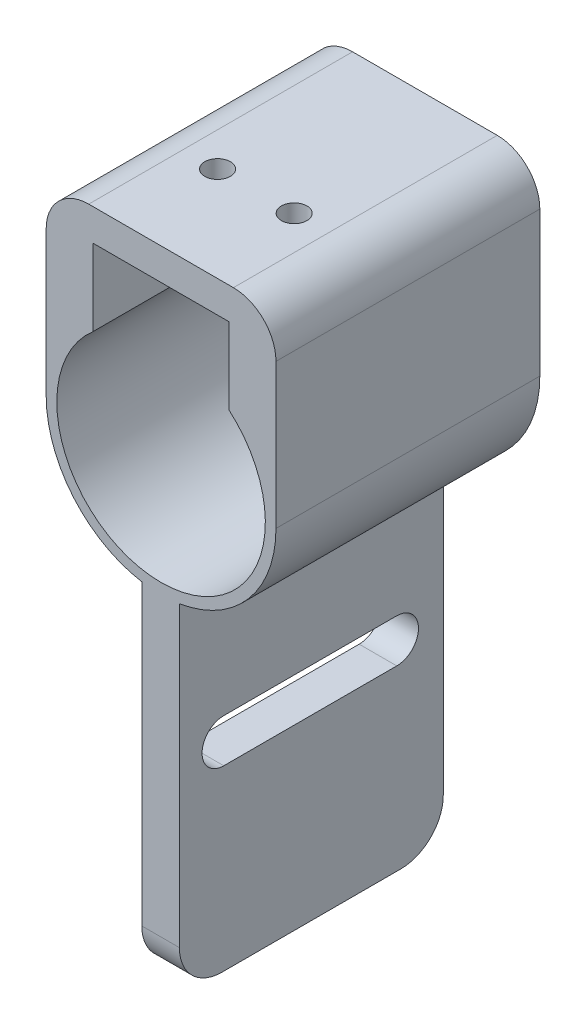
ISO-10303-21;
HEADER;
FILE_DESCRIPTION(('STEP AP214'),'2;1');
FILE_NAME('part.step','',(''),(''),'','','');
FILE_SCHEMA(('AUTOMOTIVE_DESIGN { 1 0 10303 214 1 1 1 1 }'));
ENDSEC;
DATA;
#1=APPLICATION_CONTEXT('core data for automotive mechanical design processes');
#2=APPLICATION_PROTOCOL_DEFINITION('international standard','automotive_design',2000,#1);
#3=PRODUCT_CONTEXT('',#1,'mechanical');
#4=PRODUCT('Part','Part','',(#3));
#5=PRODUCT_RELATED_PRODUCT_CATEGORY('part','',(#4));
#6=PRODUCT_DEFINITION_FORMATION('','',#4);
#7=PRODUCT_DEFINITION_CONTEXT('part definition',#1,'design');
#8=PRODUCT_DEFINITION('design','',#6,#7);
#9=PRODUCT_DEFINITION_SHAPE('','',#8);
#10=(LENGTH_UNIT() NAMED_UNIT(*) SI_UNIT(.MILLI.,.METRE.));
#11=(NAMED_UNIT(*) PLANE_ANGLE_UNIT() SI_UNIT($,.RADIAN.));
#12=(NAMED_UNIT(*) SI_UNIT($,.STERADIAN.) SOLID_ANGLE_UNIT());
#13=UNCERTAINTY_MEASURE_WITH_UNIT(LENGTH_MEASURE(1.E-05),#10,'distance_accuracy_value','');
#14=(GEOMETRIC_REPRESENTATION_CONTEXT(3) GLOBAL_UNCERTAINTY_ASSIGNED_CONTEXT((#13)) GLOBAL_UNIT_ASSIGNED_CONTEXT((#10,
#11,#12)) REPRESENTATION_CONTEXT('',''));
#15=CARTESIAN_POINT('',(0.,0.,0.));
#16=DIRECTION('',(0.,0.,1.));
#17=DIRECTION('',(1.,0.,0.));
#18=AXIS2_PLACEMENT_3D('',#15,#16,#17);
#19=CARTESIAN_POINT('',(0.,0.,31.));
#20=DIRECTION('',(0.,0.,1.));
#21=DIRECTION('',(1.,0.,0.));
#22=AXIS2_PLACEMENT_3D('',#19,#20,#21);
#23=PLANE('',#22);
#24=DIRECTION('',(0.,-1.,0.));
#25=VECTOR('',#24,1.);
#26=CARTESIAN_POINT('',(-8.,9.27698765763974,31.));
#27=LINE('',#26,#25);
#28=CARTESIAN_POINT('',(-8.,18.2769876576397,31.));
#29=VERTEX_POINT('',#28);
#30=CARTESIAN_POINT('',(-8.,9.27698765763974,31.));
#31=VERTEX_POINT('',#30);
#32=EDGE_CURVE('E235',#29,#31,#27,.T.);
#33=ORIENTED_EDGE('',*,*,#32,.F.);
#34=DIRECTION('',(-1.,0.,0.));
#35=VECTOR('',#34,1.);
#36=CARTESIAN_POINT('',(-8.,18.2769876576397,31.));
#37=LINE('',#36,#35);
#38=CARTESIAN_POINT('',(8.,18.2769876576397,31.));
#39=VERTEX_POINT('',#38);
#40=EDGE_CURVE('E236',#39,#29,#37,.T.);
#41=ORIENTED_EDGE('',*,*,#40,.F.);
#42=DIRECTION('',(0.,1.,0.));
#43=VECTOR('',#42,1.);
#44=CARTESIAN_POINT('',(8.,9.27698765763974,31.));
#45=LINE('',#44,#43);
#46=CARTESIAN_POINT('',(8.,9.27698765763974,31.));
#47=VERTEX_POINT('',#46);
#48=EDGE_CURVE('E242',#47,#39,#45,.T.);
#49=ORIENTED_EDGE('',*,*,#48,.F.);
#50=CARTESIAN_POINT('',(0.,0.,31.));
#51=DIRECTION('',(0.,0.,1.));
#52=DIRECTION('',(1.,0.,0.));
#53=AXIS2_PLACEMENT_3D('',#50,#51,#52);
#54=CIRCLE('',#53,12.25);
#55=EDGE_CURVE('E260',#31,#47,#54,.T.);
#56=ORIENTED_EDGE('',*,*,#55,.F.);
#57=EDGE_LOOP('',(#33,#41,#49,#56));
#58=FACE_BOUND('',#57,.T.);
#59=DIRECTION('',(0.,-1.,0.));
#60=VECTOR('',#59,1.);
#61=CARTESIAN_POINT('',(-2.26470282981387,-53.3268217266353,31.));
#62=LINE('',#61,#60);
#63=CARTESIAN_POINT('',(-2.26470282981387,-13.3086859265907,31.));
#64=VERTEX_POINT('',#63);
#65=CARTESIAN_POINT('',(-2.26470282981387,-48.3268217266353,31.));
#66=VERTEX_POINT('',#65);
#67=EDGE_CURVE('E269',#64,#66,#62,.T.);
#68=ORIENTED_EDGE('',*,*,#67,.T.);
#69=DIRECTION('',(1.,0.,0.));
#70=VECTOR('',#69,1.);
#71=CARTESIAN_POINT('',(2.15541705163549,-48.3268217266353,31.));
#72=LINE('',#71,#70);
#73=CARTESIAN_POINT('',(2.15541705163549,-48.3268217266353,31.));
#74=VERTEX_POINT('',#73);
#75=EDGE_CURVE('E339',#66,#74,#72,.T.);
#76=ORIENTED_EDGE('',*,*,#75,.T.);
#77=DIRECTION('',(0.,1.,0.));
#78=VECTOR('',#77,1.);
#79=CARTESIAN_POINT('',(2.15541705163549,-53.3268217266353,31.));
#80=LINE('',#79,#78);
#81=CARTESIAN_POINT('',(2.15541705163549,-13.3268217266353,31.));
#82=VERTEX_POINT('',#81);
#83=EDGE_CURVE('E272',#74,#82,#80,.T.);
#84=ORIENTED_EDGE('',*,*,#83,.T.);
#85=CARTESIAN_POINT('',(0.,0.,31.));
#86=DIRECTION('',(0.,0.,1.));
#87=DIRECTION('',(1.,0.,0.));
#88=AXIS2_PLACEMENT_3D('',#85,#86,#87);
#89=CIRCLE('',#88,13.5);
#90=CARTESIAN_POINT('',(13.5,0.,31.));
#91=VERTEX_POINT('',#90);
#92=EDGE_CURVE('E271',#82,#91,#89,.T.);
#93=ORIENTED_EDGE('',*,*,#92,.T.);
#94=DIRECTION('',(0.,1.,0.));
#95=VECTOR('',#94,1.);
#96=CARTESIAN_POINT('',(13.5,0.,31.));
#97=LINE('',#96,#95);
#98=CARTESIAN_POINT('',(13.5,17.,31.));
#99=VERTEX_POINT('',#98);
#100=EDGE_CURVE('E273',#91,#99,#97,.T.);
#101=ORIENTED_EDGE('',*,*,#100,.T.);
#102=CARTESIAN_POINT('',(8.5,17.,31.));
#103=DIRECTION('',(0.,0.,1.));
#104=DIRECTION('',(1.,0.,0.));
#105=AXIS2_PLACEMENT_3D('',#102,#103,#104);
#106=CIRCLE('',#105,5.);
#107=CARTESIAN_POINT('',(8.5,22.,31.));
#108=VERTEX_POINT('',#107);
#109=EDGE_CURVE('E337',#99,#108,#106,.T.);
#110=ORIENTED_EDGE('',*,*,#109,.T.);
#111=DIRECTION('',(-1.,0.,0.));
#112=VECTOR('',#111,1.);
#113=CARTESIAN_POINT('',(-13.5,22.,31.));
#114=LINE('',#113,#112);
#115=CARTESIAN_POINT('',(-8.5,22.,31.));
#116=VERTEX_POINT('',#115);
#117=EDGE_CURVE('E280',#108,#116,#114,.T.);
#118=ORIENTED_EDGE('',*,*,#117,.T.);
#119=CARTESIAN_POINT('',(-8.5,17.,31.));
#120=DIRECTION('',(0.,0.,1.));
#121=DIRECTION('',(1.,0.,0.));
#122=AXIS2_PLACEMENT_3D('',#119,#120,#121);
#123=CIRCLE('',#122,5.);
#124=CARTESIAN_POINT('',(-13.5,17.,31.));
#125=VERTEX_POINT('',#124);
#126=EDGE_CURVE('E53',#116,#125,#123,.T.);
#127=ORIENTED_EDGE('',*,*,#126,.T.);
#128=DIRECTION('',(0.,-1.,0.));
#129=VECTOR('',#128,1.);
#130=CARTESIAN_POINT('',(-13.5,0.,31.));
#131=LINE('',#130,#129);
#132=CARTESIAN_POINT('',(-13.5,0.,31.));
#133=VERTEX_POINT('',#132);
#134=EDGE_CURVE('E277',#125,#133,#131,.T.);
#135=ORIENTED_EDGE('',*,*,#134,.T.);
#136=CARTESIAN_POINT('',(0.,0.,31.));
#137=DIRECTION('',(0.,0.,1.));
#138=DIRECTION('',(1.,0.,0.));
#139=AXIS2_PLACEMENT_3D('',#136,#137,#138);
#140=CIRCLE('',#139,13.5);
#141=EDGE_CURVE('E261',#133,#64,#140,.T.);
#142=ORIENTED_EDGE('',*,*,#141,.T.);
#143=EDGE_LOOP('',(#68,#76,#84,#93,#101,#110,#118,#127,#135,#142));
#144=FACE_BOUND('',#143,.T.);
#145=ADVANCED_FACE('F39',(#58,#144),#23,.T.);
#146=CARTESIAN_POINT('',(0.,0.,0.));
#147=DIRECTION('',(0.,0.,1.));
#148=DIRECTION('',(1.,0.,0.));
#149=AXIS2_PLACEMENT_3D('',#146,#147,#148);
#150=PLANE('',#149);
#151=DIRECTION('',(0.,1.,0.));
#152=VECTOR('',#151,1.);
#153=CARTESIAN_POINT('',(2.15541705163549,-53.3268217266353,0.));
#154=LINE('',#153,#152);
#155=CARTESIAN_POINT('',(2.15541705163549,-48.3268217266353,0.));
#156=VERTEX_POINT('',#155);
#157=CARTESIAN_POINT('',(2.15541705163549,-13.3268217266353,0.));
#158=VERTEX_POINT('',#157);
#159=EDGE_CURVE('E287',#156,#158,#154,.T.);
#160=ORIENTED_EDGE('',*,*,#159,.F.);
#161=DIRECTION('',(1.,0.,0.));
#162=VECTOR('',#161,1.);
#163=CARTESIAN_POINT('',(0.,-48.3268217266353,0.));
#164=LINE('',#163,#162);
#165=CARTESIAN_POINT('',(-2.26470282981387,-48.3268217266353,0.));
#166=VERTEX_POINT('',#165);
#167=EDGE_CURVE('E328',#156,#166,#164,.F.);
#168=ORIENTED_EDGE('',*,*,#167,.T.);
#169=DIRECTION('',(0.,-1.,0.));
#170=VECTOR('',#169,1.);
#171=CARTESIAN_POINT('',(-2.26470282981387,-53.3268217266353,0.));
#172=LINE('',#171,#170);
#173=CARTESIAN_POINT('',(-2.26470282981387,-13.3086859265907,0.));
#174=VERTEX_POINT('',#173);
#175=EDGE_CURVE('E283',#174,#166,#172,.T.);
#176=ORIENTED_EDGE('',*,*,#175,.F.);
#177=CARTESIAN_POINT('',(0.,0.,0.));
#178=DIRECTION('',(0.,0.,1.));
#179=DIRECTION('',(1.,0.,0.));
#180=AXIS2_PLACEMENT_3D('',#177,#178,#179);
#181=CIRCLE('',#180,13.5);
#182=CARTESIAN_POINT('',(-13.5,0.,0.));
#183=VERTEX_POINT('',#182);
#184=EDGE_CURVE('E262',#183,#174,#181,.T.);
#185=ORIENTED_EDGE('',*,*,#184,.F.);
#186=DIRECTION('',(0.,-1.,0.));
#187=VECTOR('',#186,1.);
#188=CARTESIAN_POINT('',(-13.5,0.,0.));
#189=LINE('',#188,#187);
#190=CARTESIAN_POINT('',(-13.5,17.,0.));
#191=VERTEX_POINT('',#190);
#192=EDGE_CURVE('E267',#191,#183,#189,.T.);
#193=ORIENTED_EDGE('',*,*,#192,.F.);
#194=CARTESIAN_POINT('',(-8.5,17.,0.));
#195=DIRECTION('',(0.,0.,1.));
#196=DIRECTION('',(1.,0.,0.));
#197=AXIS2_PLACEMENT_3D('',#194,#195,#196);
#198=CIRCLE('',#197,5.);
#199=CARTESIAN_POINT('',(-8.5,22.,0.));
#200=VERTEX_POINT('',#199);
#201=EDGE_CURVE('E329',#191,#200,#198,.F.);
#202=ORIENTED_EDGE('',*,*,#201,.T.);
#203=DIRECTION('',(-1.,0.,0.));
#204=VECTOR('',#203,1.);
#205=CARTESIAN_POINT('',(-13.5,22.,0.));
#206=LINE('',#205,#204);
#207=CARTESIAN_POINT('',(8.5,22.,0.));
#208=VERTEX_POINT('',#207);
#209=EDGE_CURVE('E294',#208,#200,#206,.T.);
#210=ORIENTED_EDGE('',*,*,#209,.F.);
#211=CARTESIAN_POINT('',(8.5,17.,0.));
#212=DIRECTION('',(0.,0.,1.));
#213=DIRECTION('',(1.,0.,0.));
#214=AXIS2_PLACEMENT_3D('',#211,#212,#213);
#215=CIRCLE('',#214,5.);
#216=CARTESIAN_POINT('',(13.5,17.,0.));
#217=VERTEX_POINT('',#216);
#218=EDGE_CURVE('E327',#208,#217,#215,.F.);
#219=ORIENTED_EDGE('',*,*,#218,.T.);
#220=DIRECTION('',(0.,1.,0.));
#221=VECTOR('',#220,1.);
#222=CARTESIAN_POINT('',(13.5,0.,0.));
#223=LINE('',#222,#221);
#224=CARTESIAN_POINT('',(13.5,0.,0.));
#225=VERTEX_POINT('',#224);
#226=EDGE_CURVE('E292',#225,#217,#223,.T.);
#227=ORIENTED_EDGE('',*,*,#226,.F.);
#228=CARTESIAN_POINT('',(0.,0.,0.));
#229=DIRECTION('',(0.,0.,1.));
#230=DIRECTION('',(1.,0.,0.));
#231=AXIS2_PLACEMENT_3D('',#228,#229,#230);
#232=CIRCLE('',#231,13.5);
#233=EDGE_CURVE('E286',#158,#225,#232,.T.);
#234=ORIENTED_EDGE('',*,*,#233,.F.);
#235=EDGE_LOOP('',(#160,#168,#176,#185,#193,#202,#210,#219,#227,#234));
#236=FACE_BOUND('',#235,.T.);
#237=CARTESIAN_POINT('',(0.,0.,0.));
#238=DIRECTION('',(0.,0.,1.));
#239=DIRECTION('',(1.,0.,0.));
#240=AXIS2_PLACEMENT_3D('',#237,#238,#239);
#241=CIRCLE('',#240,12.25);
#242=CARTESIAN_POINT('',(12.25,0.,0.));
#243=VERTEX_POINT('',#242);
#244=EDGE_CURVE('E252',#243,#243,#241,.T.);
#245=ORIENTED_EDGE('',*,*,#244,.T.);
#246=EDGE_LOOP('',(#245));
#247=FACE_BOUND('',#246,.T.);
#248=ADVANCED_FACE('F355',(#236,#247),#150,.F.);
#249=CARTESIAN_POINT('',(0.,0.,31.));
#250=DIRECTION('',(0.,0.,-1.));
#251=DIRECTION('',(-1.,0.,0.));
#252=AXIS2_PLACEMENT_3D('',#249,#250,#251);
#253=CYLINDRICAL_SURFACE('',#252,13.5);
#254=ORIENTED_EDGE('',*,*,#184,.T.);
#255=DIRECTION('',(0.,0.,-1.));
#256=VECTOR('',#255,1.);
#257=CARTESIAN_POINT('',(-2.26470282981387,-13.3086859265907,31.));
#258=LINE('',#257,#256);
#259=EDGE_CURVE('E315',#64,#174,#258,.T.);
#260=ORIENTED_EDGE('',*,*,#259,.F.);
#261=ORIENTED_EDGE('',*,*,#141,.F.);
#262=DIRECTION('',(0.,0.,-1.));
#263=VECTOR('',#262,1.);
#264=CARTESIAN_POINT('',(-13.5,0.,31.));
#265=LINE('',#264,#263);
#266=EDGE_CURVE('E285',#133,#183,#265,.T.);
#267=ORIENTED_EDGE('',*,*,#266,.T.);
#268=EDGE_LOOP('',(#254,#260,#261,#267));
#269=FACE_BOUND('',#268,.T.);
#270=ADVANCED_FACE('F367',(#269),#253,.T.);
#271=CARTESIAN_POINT('',(-2.26470282981387,-53.3268217266353,31.));
#272=DIRECTION('',(1.,0.,0.));
#273=DIRECTION('',(0.,0.,-1.));
#274=AXIS2_PLACEMENT_3D('',#271,#272,#273);
#275=PLANE('',#274);
#276=DIRECTION('',(0.,0.,1.));
#277=VECTOR('',#276,1.);
#278=CARTESIAN_POINT('',(-2.26470282981387,-27.3268217266353,31.));
#279=LINE('',#278,#277);
#280=CARTESIAN_POINT('',(-2.26470282981387,-27.3268217266353,5.46258322292959));
#281=VERTEX_POINT('',#280);
#282=CARTESIAN_POINT('',(-2.26470282981387,-27.3268217266353,25.7873212862666));
#283=VERTEX_POINT('',#282);
#284=EDGE_CURVE('E213',#281,#283,#279,.T.);
#285=ORIENTED_EDGE('',*,*,#284,.T.);
#286=CARTESIAN_POINT('',(-2.26470282981387,-29.8768217266353,25.7873212862666));
#287=DIRECTION('',(1.,0.,0.));
#288=DIRECTION('',(0.,0.,-1.));
#289=AXIS2_PLACEMENT_3D('',#286,#287,#288);
#290=CIRCLE('',#289,2.55);
#291=CARTESIAN_POINT('',(-2.26470282981387,-32.4268217266353,25.7873212862666));
#292=VERTEX_POINT('',#291);
#293=EDGE_CURVE('E220',#283,#292,#290,.T.);
#294=ORIENTED_EDGE('',*,*,#293,.T.);
#295=DIRECTION('',(0.,0.,-1.));
#296=VECTOR('',#295,1.);
#297=CARTESIAN_POINT('',(-2.26470282981387,-32.4268217266353,31.));
#298=LINE('',#297,#296);
#299=CARTESIAN_POINT('',(-2.26470282981387,-32.4268217266353,5.4625832229296));
#300=VERTEX_POINT('',#299);
#301=EDGE_CURVE('E209',#292,#300,#298,.T.);
#302=ORIENTED_EDGE('',*,*,#301,.T.);
#303=CARTESIAN_POINT('',(-2.26470282981387,-29.8768217266353,5.46258322292959));
#304=DIRECTION('',(1.,0.,0.));
#305=DIRECTION('',(0.,0.,-1.));
#306=AXIS2_PLACEMENT_3D('',#303,#304,#305);
#307=CIRCLE('',#306,2.55);
#308=EDGE_CURVE('E183',#300,#281,#307,.T.);
#309=ORIENTED_EDGE('',*,*,#308,.T.);
#310=EDGE_LOOP('',(#285,#294,#302,#309));
#311=FACE_BOUND('',#310,.T.);
#312=ORIENTED_EDGE('',*,*,#175,.T.);
#313=CARTESIAN_POINT('',(-2.26470282981387,-48.3268217266353,5.));
#314=DIRECTION('',(1.,0.,0.));
#315=DIRECTION('',(0.,0.,-1.));
#316=AXIS2_PLACEMENT_3D('',#313,#314,#315);
#317=CIRCLE('',#316,5.);
#318=CARTESIAN_POINT('',(-2.26470282981387,-53.3268217266353,5.));
#319=VERTEX_POINT('',#318);
#320=EDGE_CURVE('E335',#166,#319,#317,.F.);
#321=ORIENTED_EDGE('',*,*,#320,.T.);
#322=DIRECTION('',(0.,0.,-1.));
#323=VECTOR('',#322,1.);
#324=CARTESIAN_POINT('',(-2.26470282981387,-53.3268217266353,31.));
#325=LINE('',#324,#323);
#326=CARTESIAN_POINT('',(-2.26470282981387,-53.3268217266353,26.));
#327=VERTEX_POINT('',#326);
#328=EDGE_CURVE('E307',#327,#319,#325,.T.);
#329=ORIENTED_EDGE('',*,*,#328,.F.);
#330=CARTESIAN_POINT('',(-2.26470282981387,-48.3268217266353,26.));
#331=DIRECTION('',(1.,0.,0.));
#332=DIRECTION('',(0.,0.,-1.));
#333=AXIS2_PLACEMENT_3D('',#330,#331,#332);
#334=CIRCLE('',#333,5.);
#335=EDGE_CURVE('E334',#327,#66,#334,.F.);
#336=ORIENTED_EDGE('',*,*,#335,.T.);
#337=ORIENTED_EDGE('',*,*,#67,.F.);
#338=ORIENTED_EDGE('',*,*,#259,.T.);
#339=EDGE_LOOP('',(#312,#321,#329,#336,#337,#338));
#340=FACE_BOUND('',#339,.T.);
#341=ADVANCED_FACE('F371',(#311,#340),#275,.F.);
#342=CARTESIAN_POINT('',(-2.26470282981387,-53.3268217266353,31.));
#343=DIRECTION('',(0.,1.,0.));
#344=DIRECTION('',(0.,0.,1.));
#345=AXIS2_PLACEMENT_3D('',#342,#343,#344);
#346=PLANE('',#345);
#347=ORIENTED_EDGE('',*,*,#328,.T.);
#348=DIRECTION('',(1.,0.,0.));
#349=VECTOR('',#348,1.);
#350=CARTESIAN_POINT('',(-2.26470282981387,-53.3268217266353,5.));
#351=LINE('',#350,#349);
#352=CARTESIAN_POINT('',(2.15541705163549,-53.3268217266353,5.));
#353=VERTEX_POINT('',#352);
#354=EDGE_CURVE('E316',#319,#353,#351,.T.);
#355=ORIENTED_EDGE('',*,*,#354,.T.);
#356=DIRECTION('',(0.,0.,-1.));
#357=VECTOR('',#356,1.);
#358=CARTESIAN_POINT('',(2.15541705163549,-53.3268217266353,31.));
#359=LINE('',#358,#357);
#360=CARTESIAN_POINT('',(2.15541705163549,-53.3268217266353,26.));
#361=VERTEX_POINT('',#360);
#362=EDGE_CURVE('E306',#361,#353,#359,.T.);
#363=ORIENTED_EDGE('',*,*,#362,.F.);
#364=DIRECTION('',(1.,0.,0.));
#365=VECTOR('',#364,1.);
#366=CARTESIAN_POINT('',(-2.26470282981387,-53.3268217266353,26.));
#367=LINE('',#366,#365);
#368=EDGE_CURVE('E320',#361,#327,#367,.F.);
#369=ORIENTED_EDGE('',*,*,#368,.T.);
#370=EDGE_LOOP('',(#347,#355,#363,#369));
#371=FACE_BOUND('',#370,.T.);
#372=ADVANCED_FACE('F393',(#371),#346,.F.);
#373=CARTESIAN_POINT('',(2.15541705163549,-53.3268217266353,31.));
#374=DIRECTION('',(-1.,0.,0.));
#375=DIRECTION('',(0.,0.,1.));
#376=AXIS2_PLACEMENT_3D('',#373,#374,#375);
#377=PLANE('',#376);
#378=DIRECTION('',(0.,0.,-1.));
#379=VECTOR('',#378,1.);
#380=CARTESIAN_POINT('',(2.15541705163549,-32.4268217266353,25.7873212862666));
#381=LINE('',#380,#379);
#382=CARTESIAN_POINT('',(2.15541705163549,-32.4268217266353,25.7873212862666));
#383=VERTEX_POINT('',#382);
#384=CARTESIAN_POINT('',(2.15541705163549,-32.4268217266353,5.46258322292959));
#385=VERTEX_POINT('',#384);
#386=EDGE_CURVE('E191',#383,#385,#381,.T.);
#387=ORIENTED_EDGE('',*,*,#386,.F.);
#388=CARTESIAN_POINT('',(2.15541705163549,-29.8768217266353,25.7873212862666));
#389=DIRECTION('',(1.,0.,0.));
#390=DIRECTION('',(0.,0.,-1.));
#391=AXIS2_PLACEMENT_3D('',#388,#389,#390);
#392=CIRCLE('',#391,2.55);
#393=CARTESIAN_POINT('',(2.15541705163549,-27.3268217266353,25.7873212862666));
#394=VERTEX_POINT('',#393);
#395=EDGE_CURVE('E200',#394,#383,#392,.T.);
#396=ORIENTED_EDGE('',*,*,#395,.F.);
#397=DIRECTION('',(0.,0.,1.));
#398=VECTOR('',#397,1.);
#399=CARTESIAN_POINT('',(2.15541705163549,-27.3268217266353,25.7873212862666));
#400=LINE('',#399,#398);
#401=CARTESIAN_POINT('',(2.15541705163549,-27.3268217266353,5.46258322292959));
#402=VERTEX_POINT('',#401);
#403=EDGE_CURVE('E204',#402,#394,#400,.T.);
#404=ORIENTED_EDGE('',*,*,#403,.F.);
#405=CARTESIAN_POINT('',(2.15541705163549,-29.8768217266353,5.46258322292959));
#406=DIRECTION('',(1.,0.,0.));
#407=DIRECTION('',(0.,0.,-1.));
#408=AXIS2_PLACEMENT_3D('',#405,#406,#407);
#409=CIRCLE('',#408,2.55);
#410=EDGE_CURVE('E181',#385,#402,#409,.T.);
#411=ORIENTED_EDGE('',*,*,#410,.F.);
#412=EDGE_LOOP('',(#387,#396,#404,#411));
#413=FACE_BOUND('',#412,.T.);
#414=ORIENTED_EDGE('',*,*,#362,.T.);
#415=CARTESIAN_POINT('',(2.15541705163549,-48.3268217266353,5.));
#416=DIRECTION('',(-1.,0.,0.));
#417=DIRECTION('',(0.,0.,1.));
#418=AXIS2_PLACEMENT_3D('',#415,#416,#417);
#419=CIRCLE('',#418,5.);
#420=EDGE_CURVE('E323',#353,#156,#419,.F.);
#421=ORIENTED_EDGE('',*,*,#420,.T.);
#422=ORIENTED_EDGE('',*,*,#159,.T.);
#423=DIRECTION('',(0.,0.,-1.));
#424=VECTOR('',#423,1.);
#425=CARTESIAN_POINT('',(2.15541705163549,-13.3268217266353,31.));
#426=LINE('',#425,#424);
#427=EDGE_CURVE('E303',#82,#158,#426,.T.);
#428=ORIENTED_EDGE('',*,*,#427,.F.);
#429=ORIENTED_EDGE('',*,*,#83,.F.);
#430=CARTESIAN_POINT('',(2.15541705163549,-48.3268217266353,26.));
#431=DIRECTION('',(-1.,0.,0.));
#432=DIRECTION('',(0.,0.,1.));
#433=AXIS2_PLACEMENT_3D('',#430,#431,#432);
#434=CIRCLE('',#433,5.);
#435=EDGE_CURVE('E321',#74,#361,#434,.F.);
#436=ORIENTED_EDGE('',*,*,#435,.T.);
#437=EDGE_LOOP('',(#414,#421,#422,#428,#429,#436));
#438=FACE_BOUND('',#437,.T.);
#439=ADVANCED_FACE('F196',(#413,#438),#377,.F.);
#440=CARTESIAN_POINT('',(0.,0.,31.));
#441=DIRECTION('',(0.,0.,-1.));
#442=DIRECTION('',(-1.,0.,0.));
#443=AXIS2_PLACEMENT_3D('',#440,#441,#442);
#444=CYLINDRICAL_SURFACE('',#443,13.5);
#445=ORIENTED_EDGE('',*,*,#233,.T.);
#446=DIRECTION('',(0.,0.,-1.));
#447=VECTOR('',#446,1.);
#448=CARTESIAN_POINT('',(13.5,0.,31.));
#449=LINE('',#448,#447);
#450=EDGE_CURVE('E297',#91,#225,#449,.T.);
#451=ORIENTED_EDGE('',*,*,#450,.F.);
#452=ORIENTED_EDGE('',*,*,#92,.F.);
#453=ORIENTED_EDGE('',*,*,#427,.T.);
#454=EDGE_LOOP('',(#445,#451,#452,#453));
#455=FACE_BOUND('',#454,.T.);
#456=ADVANCED_FACE('F383',(#455),#444,.T.);
#457=CARTESIAN_POINT('',(13.5,0.,31.));
#458=DIRECTION('',(-1.,0.,0.));
#459=DIRECTION('',(0.,-1.,0.));
#460=AXIS2_PLACEMENT_3D('',#457,#458,#459);
#461=PLANE('',#460);
#462=ORIENTED_EDGE('',*,*,#226,.T.);
#463=DIRECTION('',(0.,0.,-1.));
#464=VECTOR('',#463,1.);
#465=CARTESIAN_POINT('',(13.5,17.,31.));
#466=LINE('',#465,#464);
#467=EDGE_CURVE('E11',#217,#99,#466,.F.);
#468=ORIENTED_EDGE('',*,*,#467,.T.);
#469=ORIENTED_EDGE('',*,*,#100,.F.);
#470=ORIENTED_EDGE('',*,*,#450,.T.);
#471=EDGE_LOOP('',(#462,#468,#469,#470));
#472=FACE_BOUND('',#471,.T.);
#473=ADVANCED_FACE('F388',(#472),#461,.F.);
#474=CARTESIAN_POINT('',(-13.5,22.,31.));
#475=DIRECTION('',(0.,-1.,0.));
#476=DIRECTION('',(0.,0.,-1.));
#477=AXIS2_PLACEMENT_3D('',#474,#475,#476);
#478=PLANE('',#477);
#479=CARTESIAN_POINT('',(-4.5,22.,19.8599723157145));
#480=DIRECTION('',(0.,-1.,0.));
#481=DIRECTION('',(0.,0.,-1.));
#482=AXIS2_PLACEMENT_3D('',#479,#480,#481);
#483=CIRCLE('',#482,1.5);
#484=CARTESIAN_POINT('',(-4.5,22.,18.3599723157145));
#485=VERTEX_POINT('',#484);
#486=EDGE_CURVE('E230',#485,#485,#483,.T.);
#487=ORIENTED_EDGE('',*,*,#486,.T.);
#488=EDGE_LOOP('',(#487));
#489=FACE_BOUND('',#488,.T.);
#490=CARTESIAN_POINT('',(4.5,22.,19.8599723157145));
#491=DIRECTION('',(0.,-1.,0.));
#492=DIRECTION('',(0.,0.,-1.));
#493=AXIS2_PLACEMENT_3D('',#490,#491,#492);
#494=CIRCLE('',#493,1.5);
#495=CARTESIAN_POINT('',(4.5,22.,18.3599723157145));
#496=VERTEX_POINT('',#495);
#497=EDGE_CURVE('E225',#496,#496,#494,.T.);
#498=ORIENTED_EDGE('',*,*,#497,.T.);
#499=EDGE_LOOP('',(#498));
#500=FACE_BOUND('',#499,.T.);
#501=ORIENTED_EDGE('',*,*,#209,.T.);
#502=DIRECTION('',(0.,0.,-1.));
#503=VECTOR('',#502,1.);
#504=CARTESIAN_POINT('',(-8.5,22.,31.));
#505=LINE('',#504,#503);
#506=EDGE_CURVE('E50',#200,#116,#505,.F.);
#507=ORIENTED_EDGE('',*,*,#506,.T.);
#508=ORIENTED_EDGE('',*,*,#117,.F.);
#509=DIRECTION('',(0.,0.,-1.));
#510=VECTOR('',#509,1.);
#511=CARTESIAN_POINT('',(8.5,22.,31.));
#512=LINE('',#511,#510);
#513=EDGE_CURVE('E342',#108,#208,#512,.T.);
#514=ORIENTED_EDGE('',*,*,#513,.T.);
#515=EDGE_LOOP('',(#501,#507,#508,#514));
#516=FACE_BOUND('',#515,.T.);
#517=ADVANCED_FACE('F346',(#489,#500,#516),#478,.F.);
#518=CARTESIAN_POINT('',(-13.5,0.,31.));
#519=DIRECTION('',(1.,0.,0.));
#520=DIRECTION('',(0.,0.,-1.));
#521=AXIS2_PLACEMENT_3D('',#518,#519,#520);
#522=PLANE('',#521);
#523=ORIENTED_EDGE('',*,*,#134,.F.);
#524=DIRECTION('',(0.,0.,-1.));
#525=VECTOR('',#524,1.);
#526=CARTESIAN_POINT('',(-13.5,17.,31.));
#527=LINE('',#526,#525);
#528=EDGE_CURVE('E341',#125,#191,#527,.T.);
#529=ORIENTED_EDGE('',*,*,#528,.T.);
#530=ORIENTED_EDGE('',*,*,#192,.T.);
#531=ORIENTED_EDGE('',*,*,#266,.F.);
#532=EDGE_LOOP('',(#523,#529,#530,#531));
#533=FACE_BOUND('',#532,.T.);
#534=ADVANCED_FACE('F361',(#533),#522,.F.);
#535=CARTESIAN_POINT('',(0.,0.,31.));
#536=DIRECTION('',(0.,0.,-1.));
#537=DIRECTION('',(-1.,0.,0.));
#538=AXIS2_PLACEMENT_3D('',#535,#536,#537);
#539=CYLINDRICAL_SURFACE('',#538,12.25);
#540=DIRECTION('',(0.,0.,1.));
#541=VECTOR('',#540,1.);
#542=CARTESIAN_POINT('',(-8.,9.27698765763974,16.));
#543=LINE('',#542,#541);
#544=CARTESIAN_POINT('',(-8.,9.27698765763974,16.));
#545=VERTEX_POINT('',#544);
#546=EDGE_CURVE('E245',#545,#31,#543,.T.);
#547=ORIENTED_EDGE('',*,*,#546,.T.);
#548=ORIENTED_EDGE('',*,*,#55,.T.);
#549=DIRECTION('',(0.,0.,1.));
#550=VECTOR('',#549,1.);
#551=CARTESIAN_POINT('',(8.,9.27698765763974,16.));
#552=LINE('',#551,#550);
#553=CARTESIAN_POINT('',(8.,9.27698765763974,16.));
#554=VERTEX_POINT('',#553);
#555=EDGE_CURVE('E251',#554,#47,#552,.T.);
#556=ORIENTED_EDGE('',*,*,#555,.F.);
#557=CARTESIAN_POINT('',(0.,0.,16.));
#558=DIRECTION('',(0.,0.,-1.));
#559=DIRECTION('',(-1.,0.,0.));
#560=AXIS2_PLACEMENT_3D('',#557,#558,#559);
#561=CIRCLE('',#560,12.25);
#562=EDGE_CURVE('E314',#545,#554,#561,.T.);
#563=ORIENTED_EDGE('',*,*,#562,.F.);
#564=EDGE_LOOP('',(#547,#548,#556,#563));
#565=FACE_BOUND('',#564,.T.);
#566=ORIENTED_EDGE('',*,*,#244,.F.);
#567=EDGE_LOOP('',(#566));
#568=FACE_BOUND('',#567,.T.);
#569=ADVANCED_FACE('F413',(#565,#568),#539,.F.);
#570=CARTESIAN_POINT('',(-8.,9.27698765763974,16.));
#571=DIRECTION('',(-1.,0.,0.));
#572=DIRECTION('',(0.,0.,1.));
#573=AXIS2_PLACEMENT_3D('',#570,#571,#572);
#574=PLANE('',#573);
#575=ORIENTED_EDGE('',*,*,#32,.T.);
#576=ORIENTED_EDGE('',*,*,#546,.F.);
#577=DIRECTION('',(0.,-1.,0.));
#578=VECTOR('',#577,1.);
#579=CARTESIAN_POINT('',(-8.,9.27698765763974,16.));
#580=LINE('',#579,#578);
#581=CARTESIAN_POINT('',(-8.,18.2769876576397,16.));
#582=VERTEX_POINT('',#581);
#583=EDGE_CURVE('E231',#582,#545,#580,.T.);
#584=ORIENTED_EDGE('',*,*,#583,.F.);
#585=DIRECTION('',(0.,0.,1.));
#586=VECTOR('',#585,1.);
#587=CARTESIAN_POINT('',(-8.,18.2769876576397,16.));
#588=LINE('',#587,#586);
#589=EDGE_CURVE('E248',#582,#29,#588,.T.);
#590=ORIENTED_EDGE('',*,*,#589,.T.);
#591=EDGE_LOOP('',(#575,#576,#584,#590));
#592=FACE_BOUND('',#591,.T.);
#593=ADVANCED_FACE('F439',(#592),#574,.F.);
#594=CARTESIAN_POINT('',(-8.,18.2769876576397,16.));
#595=DIRECTION('',(0.,1.,0.));
#596=DIRECTION('',(0.,0.,1.));
#597=AXIS2_PLACEMENT_3D('',#594,#595,#596);
#598=PLANE('',#597);
#599=CARTESIAN_POINT('',(-4.5,18.2769876576397,19.8599723157145));
#600=DIRECTION('',(0.,-1.,0.));
#601=DIRECTION('',(0.,0.,-1.));
#602=AXIS2_PLACEMENT_3D('',#599,#600,#601);
#603=CIRCLE('',#602,1.5);
#604=CARTESIAN_POINT('',(-4.5,18.2769876576397,18.3599723157145));
#605=VERTEX_POINT('',#604);
#606=EDGE_CURVE('E223',#605,#605,#603,.T.);
#607=ORIENTED_EDGE('',*,*,#606,.F.);
#608=EDGE_LOOP('',(#607));
#609=FACE_BOUND('',#608,.T.);
#610=CARTESIAN_POINT('',(4.5,18.2769876576397,19.8599723157145));
#611=DIRECTION('',(0.,-1.,0.));
#612=DIRECTION('',(0.,0.,-1.));
#613=AXIS2_PLACEMENT_3D('',#610,#611,#612);
#614=CIRCLE('',#613,1.5);
#615=CARTESIAN_POINT('',(4.5,18.2769876576397,18.3599723157145));
#616=VERTEX_POINT('',#615);
#617=EDGE_CURVE('E218',#616,#616,#614,.T.);
#618=ORIENTED_EDGE('',*,*,#617,.F.);
#619=EDGE_LOOP('',(#618));
#620=FACE_BOUND('',#619,.T.);
#621=ORIENTED_EDGE('',*,*,#40,.T.);
#622=ORIENTED_EDGE('',*,*,#589,.F.);
#623=DIRECTION('',(-1.,0.,0.));
#624=VECTOR('',#623,1.);
#625=CARTESIAN_POINT('',(-8.,18.2769876576397,16.));
#626=LINE('',#625,#624);
#627=CARTESIAN_POINT('',(8.,18.2769876576397,16.));
#628=VERTEX_POINT('',#627);
#629=EDGE_CURVE('E237',#628,#582,#626,.T.);
#630=ORIENTED_EDGE('',*,*,#629,.F.);
#631=DIRECTION('',(0.,0.,1.));
#632=VECTOR('',#631,1.);
#633=CARTESIAN_POINT('',(8.,18.2769876576397,16.));
#634=LINE('',#633,#632);
#635=EDGE_CURVE('E255',#628,#39,#634,.T.);
#636=ORIENTED_EDGE('',*,*,#635,.T.);
#637=EDGE_LOOP('',(#621,#622,#630,#636));
#638=FACE_BOUND('',#637,.T.);
#639=ADVANCED_FACE('F446',(#609,#620,#638),#598,.F.);
#640=CARTESIAN_POINT('',(8.,9.27698765763974,16.));
#641=DIRECTION('',(1.,0.,0.));
#642=DIRECTION('',(0.,0.,-1.));
#643=AXIS2_PLACEMENT_3D('',#640,#641,#642);
#644=PLANE('',#643);
#645=ORIENTED_EDGE('',*,*,#48,.T.);
#646=ORIENTED_EDGE('',*,*,#635,.F.);
#647=DIRECTION('',(0.,1.,0.));
#648=VECTOR('',#647,1.);
#649=CARTESIAN_POINT('',(8.,9.27698765763974,16.));
#650=LINE('',#649,#648);
#651=EDGE_CURVE('E232',#554,#628,#650,.T.);
#652=ORIENTED_EDGE('',*,*,#651,.F.);
#653=ORIENTED_EDGE('',*,*,#555,.T.);
#654=EDGE_LOOP('',(#645,#646,#652,#653));
#655=FACE_BOUND('',#654,.T.);
#656=ADVANCED_FACE('F452',(#655),#644,.F.);
#657=CARTESIAN_POINT('',(0.,0.,16.));
#658=DIRECTION('',(0.,0.,-1.));
#659=DIRECTION('',(-1.,0.,0.));
#660=AXIS2_PLACEMENT_3D('',#657,#658,#659);
#661=PLANE('',#660);
#662=ORIENTED_EDGE('',*,*,#562,.T.);
#663=ORIENTED_EDGE('',*,*,#651,.T.);
#664=ORIENTED_EDGE('',*,*,#629,.T.);
#665=ORIENTED_EDGE('',*,*,#583,.T.);
#666=EDGE_LOOP('',(#662,#663,#664,#665));
#667=FACE_BOUND('',#666,.T.);
#668=ADVANCED_FACE('F456',(#667),#661,.F.);
#669=CARTESIAN_POINT('',(4.5,33.2769876576397,19.8599723157145));
#670=DIRECTION('',(0.,-1.,0.));
#671=DIRECTION('',(0.,0.,-1.));
#672=AXIS2_PLACEMENT_3D('',#669,#670,#671);
#673=CYLINDRICAL_SURFACE('',#672,1.5);
#674=ORIENTED_EDGE('',*,*,#617,.T.);
#675=EDGE_LOOP('',(#674));
#676=FACE_BOUND('',#675,.T.);
#677=ORIENTED_EDGE('',*,*,#497,.F.);
#678=EDGE_LOOP('',(#677));
#679=FACE_BOUND('',#678,.T.);
#680=ADVANCED_FACE('F466',(#676,#679),#673,.F.);
#681=CARTESIAN_POINT('',(-4.5,33.2769876576397,19.8599723157145));
#682=DIRECTION('',(0.,-1.,0.));
#683=DIRECTION('',(0.,0.,-1.));
#684=AXIS2_PLACEMENT_3D('',#681,#682,#683);
#685=CYLINDRICAL_SURFACE('',#684,1.5);
#686=ORIENTED_EDGE('',*,*,#606,.T.);
#687=EDGE_LOOP('',(#686));
#688=FACE_BOUND('',#687,.T.);
#689=ORIENTED_EDGE('',*,*,#486,.F.);
#690=EDGE_LOOP('',(#689));
#691=FACE_BOUND('',#690,.T.);
#692=ADVANCED_FACE('F485',(#688,#691),#685,.F.);
#693=CARTESIAN_POINT('',(-12.8445829483645,-29.8768217266353,25.7873212862666));
#694=DIRECTION('',(1.,0.,0.));
#695=DIRECTION('',(0.,0.,-1.));
#696=AXIS2_PLACEMENT_3D('',#693,#694,#695);
#697=CYLINDRICAL_SURFACE('',#696,2.55);
#698=DIRECTION('',(1.,0.,0.));
#699=VECTOR('',#698,1.);
#700=CARTESIAN_POINT('',(-12.8445829483645,-27.3268217266353,25.7873212862666));
#701=LINE('',#700,#699);
#702=EDGE_CURVE('E210',#283,#394,#701,.T.);
#703=ORIENTED_EDGE('',*,*,#702,.T.);
#704=ORIENTED_EDGE('',*,*,#395,.T.);
#705=DIRECTION('',(1.,0.,0.));
#706=VECTOR('',#705,1.);
#707=CARTESIAN_POINT('',(-12.8445829483645,-32.4268217266353,25.7873212862666));
#708=LINE('',#707,#706);
#709=EDGE_CURVE('E189',#292,#383,#708,.T.);
#710=ORIENTED_EDGE('',*,*,#709,.F.);
#711=ORIENTED_EDGE('',*,*,#293,.F.);
#712=EDGE_LOOP('',(#703,#704,#710,#711));
#713=FACE_BOUND('',#712,.T.);
#714=ADVANCED_FACE('F491',(#713),#697,.F.);
#715=CARTESIAN_POINT('',(-12.8445829483645,-27.3268217266353,25.7873212862666));
#716=DIRECTION('',(0.,1.,0.));
#717=DIRECTION('',(0.,0.,1.));
#718=AXIS2_PLACEMENT_3D('',#715,#716,#717);
#719=PLANE('',#718);
#720=DIRECTION('',(1.,0.,0.));
#721=VECTOR('',#720,1.);
#722=CARTESIAN_POINT('',(-12.8445829483645,-27.3268217266353,5.46258322292959));
#723=LINE('',#722,#721);
#724=EDGE_CURVE('E190',#281,#402,#723,.T.);
#725=ORIENTED_EDGE('',*,*,#724,.T.);
#726=ORIENTED_EDGE('',*,*,#403,.T.);
#727=ORIENTED_EDGE('',*,*,#702,.F.);
#728=ORIENTED_EDGE('',*,*,#284,.F.);
#729=EDGE_LOOP('',(#725,#726,#727,#728));
#730=FACE_BOUND('',#729,.T.);
#731=ADVANCED_FACE('F505',(#730),#719,.F.);
#732=CARTESIAN_POINT('',(-12.8445829483645,-29.8768217266353,5.46258322292959));
#733=DIRECTION('',(1.,0.,0.));
#734=DIRECTION('',(0.,0.,-1.));
#735=AXIS2_PLACEMENT_3D('',#732,#733,#734);
#736=CYLINDRICAL_SURFACE('',#735,2.55);
#737=DIRECTION('',(1.,0.,0.));
#738=VECTOR('',#737,1.);
#739=CARTESIAN_POINT('',(-12.8445829483645,-32.4268217266353,5.46258322292959));
#740=LINE('',#739,#738);
#741=EDGE_CURVE('E176',#300,#385,#740,.T.);
#742=ORIENTED_EDGE('',*,*,#741,.T.);
#743=ORIENTED_EDGE('',*,*,#410,.T.);
#744=ORIENTED_EDGE('',*,*,#724,.F.);
#745=ORIENTED_EDGE('',*,*,#308,.F.);
#746=EDGE_LOOP('',(#742,#743,#744,#745));
#747=FACE_BOUND('',#746,.T.);
#748=ADVANCED_FACE('F178',(#747),#736,.F.);
#749=CARTESIAN_POINT('',(-12.8445829483645,-32.4268217266353,25.7873212862666));
#750=DIRECTION('',(0.,-1.,0.));
#751=DIRECTION('',(0.,0.,-1.));
#752=AXIS2_PLACEMENT_3D('',#749,#750,#751);
#753=PLANE('',#752);
#754=ORIENTED_EDGE('',*,*,#709,.T.);
#755=ORIENTED_EDGE('',*,*,#386,.T.);
#756=ORIENTED_EDGE('',*,*,#741,.F.);
#757=ORIENTED_EDGE('',*,*,#301,.F.);
#758=EDGE_LOOP('',(#754,#755,#756,#757));
#759=FACE_BOUND('',#758,.T.);
#760=ADVANCED_FACE('F195',(#759),#753,.F.);
#761=CARTESIAN_POINT('',(-2.26470282981387,-48.3268217266353,5.));
#762=DIRECTION('',(1.,0.,0.));
#763=DIRECTION('',(0.,0.,-1.));
#764=AXIS2_PLACEMENT_3D('',#761,#762,#763);
#765=CYLINDRICAL_SURFACE('',#764,5.);
#766=ORIENTED_EDGE('',*,*,#320,.F.);
#767=ORIENTED_EDGE('',*,*,#167,.F.);
#768=ORIENTED_EDGE('',*,*,#420,.F.);
#769=ORIENTED_EDGE('',*,*,#354,.F.);
#770=EDGE_LOOP('',(#766,#767,#768,#769));
#771=FACE_BOUND('',#770,.T.);
#772=ADVANCED_FACE('F395',(#771),#765,.T.);
#773=CARTESIAN_POINT('',(0.,-48.3268217266353,26.));
#774=DIRECTION('',(-1.,0.,0.));
#775=DIRECTION('',(0.,0.,1.));
#776=AXIS2_PLACEMENT_3D('',#773,#774,#775);
#777=CYLINDRICAL_SURFACE('',#776,5.);
#778=ORIENTED_EDGE('',*,*,#335,.F.);
#779=ORIENTED_EDGE('',*,*,#368,.F.);
#780=ORIENTED_EDGE('',*,*,#435,.F.);
#781=ORIENTED_EDGE('',*,*,#75,.F.);
#782=EDGE_LOOP('',(#778,#779,#780,#781));
#783=FACE_BOUND('',#782,.T.);
#784=ADVANCED_FACE('F380',(#783),#777,.T.);
#785=CARTESIAN_POINT('',(-8.5,17.,31.));
#786=DIRECTION('',(0.,0.,-1.));
#787=DIRECTION('',(-1.,0.,0.));
#788=AXIS2_PLACEMENT_3D('',#785,#786,#787);
#789=CYLINDRICAL_SURFACE('',#788,5.);
#790=ORIENTED_EDGE('',*,*,#126,.F.);
#791=ORIENTED_EDGE('',*,*,#506,.F.);
#792=ORIENTED_EDGE('',*,*,#201,.F.);
#793=ORIENTED_EDGE('',*,*,#528,.F.);
#794=EDGE_LOOP('',(#790,#791,#792,#793));
#795=FACE_BOUND('',#794,.T.);
#796=ADVANCED_FACE('F363',(#795),#789,.T.);
#797=CARTESIAN_POINT('',(8.5,17.,31.));
#798=DIRECTION('',(0.,0.,-1.));
#799=DIRECTION('',(-1.,0.,0.));
#800=AXIS2_PLACEMENT_3D('',#797,#798,#799);
#801=CYLINDRICAL_SURFACE('',#800,5.);
#802=ORIENTED_EDGE('',*,*,#109,.F.);
#803=ORIENTED_EDGE('',*,*,#467,.F.);
#804=ORIENTED_EDGE('',*,*,#218,.F.);
#805=ORIENTED_EDGE('',*,*,#513,.F.);
#806=EDGE_LOOP('',(#802,#803,#804,#805));
#807=FACE_BOUND('',#806,.T.);
#808=ADVANCED_FACE('F41',(#807),#801,.T.);
#809=CLOSED_SHELL('',(#145,#248,#270,#341,#372,#439,#456,#473,#517,#534,#569,#593,#639,#656,
#668,#680,#692,#714,#731,#748,#760,#772,#784,#796,#808));
#810=MANIFOLD_SOLID_BREP('B2',#809);
#811=ADVANCED_BREP_SHAPE_REPRESENTATION('',(#18,#810),#14);
#812=SHAPE_DEFINITION_REPRESENTATION(#9,#811);
ENDSEC;
END-ISO-10303-21;
